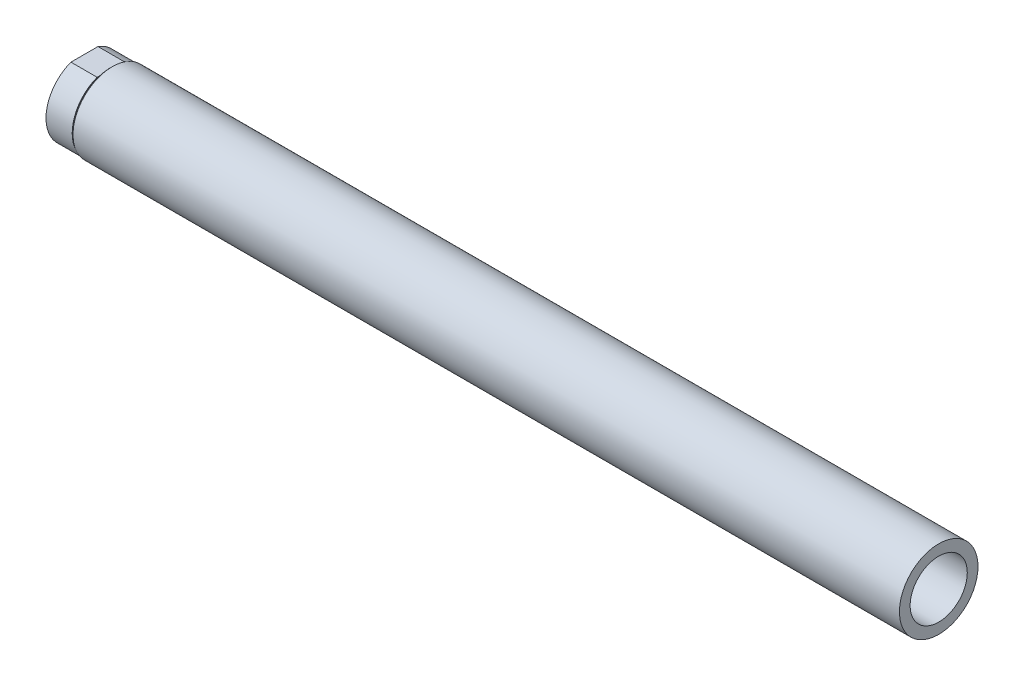
ISO-10303-21;
HEADER;
FILE_DESCRIPTION(('STEP AP214'),'2;1');
FILE_NAME('part.step','',(''),(''),'','','');
FILE_SCHEMA(('AUTOMOTIVE_DESIGN { 1 0 10303 214 1 1 1 1 }'));
ENDSEC;
DATA;
#1=APPLICATION_CONTEXT('core data for automotive mechanical design processes');
#2=APPLICATION_PROTOCOL_DEFINITION('international standard','automotive_design',2000,#1);
#3=PRODUCT_CONTEXT('',#1,'mechanical');
#4=PRODUCT('Part','Part','',(#3));
#5=PRODUCT_RELATED_PRODUCT_CATEGORY('part','',(#4));
#6=PRODUCT_DEFINITION_FORMATION('','',#4);
#7=PRODUCT_DEFINITION_CONTEXT('part definition',#1,'design');
#8=PRODUCT_DEFINITION('design','',#6,#7);
#9=PRODUCT_DEFINITION_SHAPE('','',#8);
#10=(LENGTH_UNIT() NAMED_UNIT(*) SI_UNIT(.MILLI.,.METRE.));
#11=(NAMED_UNIT(*) PLANE_ANGLE_UNIT() SI_UNIT($,.RADIAN.));
#12=(NAMED_UNIT(*) SI_UNIT($,.STERADIAN.) SOLID_ANGLE_UNIT());
#13=UNCERTAINTY_MEASURE_WITH_UNIT(LENGTH_MEASURE(1.E-05),#10,'distance_accuracy_value','');
#14=(GEOMETRIC_REPRESENTATION_CONTEXT(3) GLOBAL_UNCERTAINTY_ASSIGNED_CONTEXT((#13)) GLOBAL_UNIT_ASSIGNED_CONTEXT((#10,
#11,#12)) REPRESENTATION_CONTEXT('',''));
#15=CARTESIAN_POINT('',(0.,0.,0.));
#16=DIRECTION('',(0.,0.,1.));
#17=DIRECTION('',(1.,0.,0.));
#18=AXIS2_PLACEMENT_3D('',#15,#16,#17);
#19=CARTESIAN_POINT('',(-23.6261718694748,0.,0.));
#20=DIRECTION('',(1.,0.,0.));
#21=DIRECTION('',(0.,0.,-1.));
#22=AXIS2_PLACEMENT_3D('',#19,#20,#21);
#23=CYLINDRICAL_SURFACE('',#22,5.87499999999999);
#24=DIRECTION('',(1.,0.,0.));
#25=VECTOR('',#24,1.);
#26=CARTESIAN_POINT('',(-23.6261718694748,-5.50000000000002,2.06533895523223));
#27=LINE('',#26,#25);
#28=CARTESIAN_POINT('',(-63.25,-5.50000000000001,2.06533895523225));
#29=VERTEX_POINT('',#28);
#30=CARTESIAN_POINT('',(-67.25,-5.50000000000001,2.06533895523223));
#31=VERTEX_POINT('',#30);
#32=EDGE_CURVE('E97',#29,#31,#27,.F.);
#33=ORIENTED_EDGE('',*,*,#32,.F.);
#34=CARTESIAN_POINT('',(-63.25,0.,0.));
#35=DIRECTION('',(1.,0.,0.));
#36=DIRECTION('',(0.,0.,-1.));
#37=AXIS2_PLACEMENT_3D('',#34,#35,#36);
#38=CIRCLE('',#37,5.87499999999999);
#39=CARTESIAN_POINT('',(-63.25,5.5,2.06533895523228));
#40=VERTEX_POINT('',#39);
#41=EDGE_CURVE('E112',#40,#29,#38,.T.);
#42=ORIENTED_EDGE('',*,*,#41,.F.);
#43=DIRECTION('',(1.,0.,0.));
#44=VECTOR('',#43,1.);
#45=CARTESIAN_POINT('',(-23.6261718694748,5.50000000000001,2.06533895523226));
#46=LINE('',#45,#44);
#47=CARTESIAN_POINT('',(-67.25,5.5,2.06533895523226));
#48=VERTEX_POINT('',#47);
#49=EDGE_CURVE('E101',#48,#40,#46,.T.);
#50=ORIENTED_EDGE('',*,*,#49,.F.);
#51=CARTESIAN_POINT('',(-67.25,0.,0.));
#52=DIRECTION('',(1.,0.,0.));
#53=DIRECTION('',(0.,0.,-1.));
#54=AXIS2_PLACEMENT_3D('',#51,#52,#53);
#55=CIRCLE('',#54,5.87499999999999);
#56=EDGE_CURVE('E108',#48,#31,#55,.T.);
#57=ORIENTED_EDGE('',*,*,#56,.T.);
#58=EDGE_LOOP('',(#33,#42,#50,#57));
#59=FACE_BOUND('',#58,.T.);
#60=ADVANCED_FACE('F16',(#59),#23,.T.);
#61=CARTESIAN_POINT('',(-63.25,5.87499999999999,0.));
#62=DIRECTION('',(1.,0.,0.));
#63=DIRECTION('',(0.,0.,-1.));
#64=AXIS2_PLACEMENT_3D('',#61,#62,#63);
#65=PLANE('',#64);
#66=DIRECTION('',(0.,0.,1.));
#67=VECTOR('',#66,1.);
#68=CARTESIAN_POINT('',(-63.25,-5.50000000000001,0.));
#69=LINE('',#68,#67);
#70=CARTESIAN_POINT('',(-63.25,-5.50000000000001,-2.06533895523225));
#71=VERTEX_POINT('',#70);
#72=CARTESIAN_POINT('',(-63.25,-5.50000000000001,-1.66587381349844));
#73=VERTEX_POINT('',#72);
#74=EDGE_CURVE('E11',#71,#73,#69,.T.);
#75=ORIENTED_EDGE('',*,*,#74,.F.);
#76=CARTESIAN_POINT('',(-63.25,5.5,-2.06533895523228));
#77=VERTEX_POINT('',#76);
#78=EDGE_CURVE('E111',#71,#77,#38,.T.);
#79=ORIENTED_EDGE('',*,*,#78,.T.);
#80=DIRECTION('',(0.,0.,-1.));
#81=VECTOR('',#80,1.);
#82=CARTESIAN_POINT('',(-63.25,5.5,0.));
#83=LINE('',#82,#81);
#84=CARTESIAN_POINT('',(-63.25,5.5,-1.66587381349847));
#85=VERTEX_POINT('',#84);
#86=EDGE_CURVE('E130',#85,#77,#83,.T.);
#87=ORIENTED_EDGE('',*,*,#86,.F.);
#88=CARTESIAN_POINT('',(-63.25,0.,0.));
#89=DIRECTION('',(1.,0.,0.));
#90=DIRECTION('',(0.,0.,-1.));
#91=AXIS2_PLACEMENT_3D('',#88,#89,#90);
#92=CIRCLE('',#91,5.74674999999999);
#93=EDGE_CURVE('E128',#85,#73,#92,.F.);
#94=ORIENTED_EDGE('',*,*,#93,.T.);
#95=EDGE_LOOP('',(#75,#79,#87,#94));
#96=FACE_BOUND('',#95,.T.);
#97=ADVANCED_FACE('F154',(#96),#65,.T.);
#98=CARTESIAN_POINT('',(63.25,0.,0.));
#99=DIRECTION('',(1.,0.,0.));
#100=DIRECTION('',(0.,0.,-1.));
#101=AXIS2_PLACEMENT_3D('',#98,#99,#100);
#102=PLANE('',#101);
#103=CARTESIAN_POINT('',(63.25,0.,0.));
#104=DIRECTION('',(1.,0.,0.));
#105=DIRECTION('',(0.,0.,-1.));
#106=AXIS2_PLACEMENT_3D('',#103,#104,#105);
#107=CIRCLE('',#106,6.00075);
#108=CARTESIAN_POINT('',(63.25,0.,-6.00075));
#109=VERTEX_POINT('',#108);
#110=EDGE_CURVE('E118',#109,#109,#107,.T.);
#111=ORIENTED_EDGE('',*,*,#110,.T.);
#112=EDGE_LOOP('',(#111));
#113=FACE_BOUND('',#112,.T.);
#114=CARTESIAN_POINT('',(63.25,0.,0.));
#115=DIRECTION('',(1.,0.,0.));
#116=DIRECTION('',(0.,0.,-1.));
#117=AXIS2_PLACEMENT_3D('',#114,#115,#116);
#118=CIRCLE('',#117,4.365);
#119=CARTESIAN_POINT('',(63.25,0.,-4.365));
#120=VERTEX_POINT('',#119);
#121=EDGE_CURVE('E115',#120,#120,#118,.T.);
#122=ORIENTED_EDGE('',*,*,#121,.F.);
#123=EDGE_LOOP('',(#122));
#124=FACE_BOUND('',#123,.T.);
#125=ADVANCED_FACE('F178',(#113,#124),#102,.T.);
#126=CARTESIAN_POINT('',(63.25,0.,0.));
#127=DIRECTION('',(-1.,0.,0.));
#128=DIRECTION('',(0.,0.,1.));
#129=AXIS2_PLACEMENT_3D('',#126,#127,#128);
#130=CYLINDRICAL_SURFACE('',#129,6.00075);
#131=CARTESIAN_POINT('',(-62.996,0.,0.));
#132=DIRECTION('',(1.,0.,0.));
#133=DIRECTION('',(0.,0.,-1.));
#134=AXIS2_PLACEMENT_3D('',#131,#132,#133);
#135=CIRCLE('',#134,6.00075);
#136=CARTESIAN_POINT('',(-62.996,0.,-6.00075));
#137=VERTEX_POINT('',#136);
#138=EDGE_CURVE('E121',#137,#137,#135,.T.);
#139=ORIENTED_EDGE('',*,*,#138,.T.);
#140=EDGE_LOOP('',(#139));
#141=FACE_BOUND('',#140,.T.);
#142=ORIENTED_EDGE('',*,*,#110,.F.);
#143=EDGE_LOOP('',(#142));
#144=FACE_BOUND('',#143,.T.);
#145=ADVANCED_FACE('F252',(#141,#144),#130,.T.);
#146=CARTESIAN_POINT('',(63.25,0.,0.));
#147=DIRECTION('',(-1.,0.,0.));
#148=DIRECTION('',(0.,0.,1.));
#149=AXIS2_PLACEMENT_3D('',#146,#147,#148);
#150=CYLINDRICAL_SURFACE('',#149,4.365);
#151=CARTESIAN_POINT('',(-56.455,0.,0.));
#152=DIRECTION('',(1.,0.,0.));
#153=DIRECTION('',(0.,0.,-1.));
#154=AXIS2_PLACEMENT_3D('',#151,#152,#153);
#155=CIRCLE('',#154,4.365);
#156=CARTESIAN_POINT('',(-56.455,0.,-4.365));
#157=VERTEX_POINT('',#156);
#158=EDGE_CURVE('E127',#157,#157,#155,.T.);
#159=ORIENTED_EDGE('',*,*,#158,.F.);
#160=EDGE_LOOP('',(#159));
#161=FACE_BOUND('',#160,.T.);
#162=ORIENTED_EDGE('',*,*,#121,.T.);
#163=EDGE_LOOP('',(#162));
#164=FACE_BOUND('',#163,.T.);
#165=ADVANCED_FACE('F196',(#161,#164),#150,.F.);
#166=CARTESIAN_POINT('',(-62.996,0.,0.));
#167=DIRECTION('',(1.,0.,0.));
#168=DIRECTION('',(0.,0.,-1.));
#169=AXIS2_PLACEMENT_3D('',#166,#167,#168);
#170=CONICAL_SURFACE('',#169,6.00075,0.785398163397399);
#171=CARTESIAN_POINT('',(-63.25,5.5,1.66587381349847));
#172=VERTEX_POINT('',#171);
#173=EDGE_CURVE('E125',#172,#85,#92,.F.);
#174=ORIENTED_EDGE('',*,*,#173,.F.);
#175=CARTESIAN_POINT('',(-63.25,-5.50000000000001,1.66587381349844));
#176=VERTEX_POINT('',#175);
#177=EDGE_CURVE('E124',#176,#172,#92,.F.);
#178=ORIENTED_EDGE('',*,*,#177,.F.);
#179=EDGE_CURVE('E148',#73,#176,#92,.F.);
#180=ORIENTED_EDGE('',*,*,#179,.F.);
#181=ORIENTED_EDGE('',*,*,#93,.F.);
#182=EDGE_LOOP('',(#174,#178,#180,#181));
#183=FACE_BOUND('',#182,.T.);
#184=ORIENTED_EDGE('',*,*,#138,.F.);
#185=EDGE_LOOP('',(#184));
#186=FACE_BOUND('',#185,.T.);
#187=ADVANCED_FACE('F18',(#183,#186),#170,.T.);
#188=CARTESIAN_POINT('',(-67.25,5.87499999999999,0.));
#189=DIRECTION('',(-1.,0.,0.));
#190=DIRECTION('',(0.,0.,1.));
#191=AXIS2_PLACEMENT_3D('',#188,#189,#190);
#192=PLANE('',#191);
#193=CARTESIAN_POINT('',(-67.25,0.,0.));
#194=DIRECTION('',(-1.,0.,0.));
#195=DIRECTION('',(0.,0.,1.));
#196=AXIS2_PLACEMENT_3D('',#193,#194,#195);
#197=CIRCLE('',#196,2.5);
#198=CARTESIAN_POINT('',(-67.25,0.,2.5));
#199=VERTEX_POINT('',#198);
#200=EDGE_CURVE('E88',#199,#199,#197,.T.);
#201=ORIENTED_EDGE('',*,*,#200,.F.);
#202=EDGE_LOOP('',(#201));
#203=FACE_BOUND('',#202,.T.);
#204=DIRECTION('',(0.,0.,1.));
#205=VECTOR('',#204,1.);
#206=CARTESIAN_POINT('',(-67.25,-5.50000000000001,-6.00075));
#207=LINE('',#206,#205);
#208=CARTESIAN_POINT('',(-67.25,-5.50000000000001,-2.06533895523223));
#209=VERTEX_POINT('',#208);
#210=EDGE_CURVE('E91',#209,#31,#207,.T.);
#211=ORIENTED_EDGE('',*,*,#210,.T.);
#212=ORIENTED_EDGE('',*,*,#56,.F.);
#213=DIRECTION('',(0.,0.,1.));
#214=VECTOR('',#213,1.);
#215=CARTESIAN_POINT('',(-67.25,5.5,-6.00075));
#216=LINE('',#215,#214);
#217=CARTESIAN_POINT('',(-67.25,5.5,-2.06533895523226));
#218=VERTEX_POINT('',#217);
#219=EDGE_CURVE('E99',#218,#48,#216,.T.);
#220=ORIENTED_EDGE('',*,*,#219,.F.);
#221=EDGE_CURVE('E107',#209,#218,#55,.T.);
#222=ORIENTED_EDGE('',*,*,#221,.F.);
#223=EDGE_LOOP('',(#211,#212,#220,#222));
#224=FACE_BOUND('',#223,.T.);
#225=ADVANCED_FACE('F182',(#203,#224),#192,.T.);
#226=DIRECTION('',(1.,0.,0.));
#227=VECTOR('',#226,1.);
#228=CARTESIAN_POINT('',(-23.6261718694748,-5.50000000000002,-2.06533895523223));
#229=LINE('',#228,#227);
#230=EDGE_CURVE('E94',#209,#71,#229,.T.);
#231=ORIENTED_EDGE('',*,*,#230,.F.);
#232=ORIENTED_EDGE('',*,*,#221,.T.);
#233=DIRECTION('',(1.,0.,0.));
#234=VECTOR('',#233,1.);
#235=CARTESIAN_POINT('',(-23.6261718694748,5.50000000000001,-2.06533895523226));
#236=LINE('',#235,#234);
#237=EDGE_CURVE('E104',#77,#218,#236,.F.);
#238=ORIENTED_EDGE('',*,*,#237,.F.);
#239=ORIENTED_EDGE('',*,*,#78,.F.);
#240=EDGE_LOOP('',(#231,#232,#238,#239));
#241=FACE_BOUND('',#240,.T.);
#242=ADVANCED_FACE('F174',(#241),#23,.T.);
#243=EDGE_CURVE('E20',#176,#29,#69,.T.);
#244=ORIENTED_EDGE('',*,*,#243,.F.);
#245=ORIENTED_EDGE('',*,*,#177,.T.);
#246=EDGE_CURVE('E131',#40,#172,#83,.T.);
#247=ORIENTED_EDGE('',*,*,#246,.F.);
#248=ORIENTED_EDGE('',*,*,#41,.T.);
#249=EDGE_LOOP('',(#244,#245,#247,#248));
#250=FACE_BOUND('',#249,.T.);
#251=ADVANCED_FACE('F144',(#250),#65,.T.);
#252=CARTESIAN_POINT('',(-56.455,4.365,0.));
#253=DIRECTION('',(1.,0.,0.));
#254=DIRECTION('',(0.,0.,-1.));
#255=AXIS2_PLACEMENT_3D('',#252,#253,#254);
#256=PLANE('',#255);
#257=ORIENTED_EDGE('',*,*,#158,.T.);
#258=EDGE_LOOP('',(#257));
#259=FACE_BOUND('',#258,.T.);
#260=ADVANCED_FACE('F161',(#259),#256,.T.);
#261=CARTESIAN_POINT('',(-63.25,5.87499999999999,-6.00075));
#262=DIRECTION('',(1.,0.,0.));
#263=DIRECTION('',(0.,0.,-1.));
#264=AXIS2_PLACEMENT_3D('',#261,#262,#263);
#265=PLANE('',#264);
#266=ORIENTED_EDGE('',*,*,#173,.T.);
#267=DIRECTION('',(0.,0.,1.));
#268=VECTOR('',#267,1.);
#269=CARTESIAN_POINT('',(-63.25,5.5,-6.00075));
#270=LINE('',#269,#268);
#271=EDGE_CURVE('E38',#85,#172,#270,.T.);
#272=ORIENTED_EDGE('',*,*,#271,.T.);
#273=EDGE_LOOP('',(#266,#272));
#274=FACE_BOUND('',#273,.T.);
#275=ADVANCED_FACE('F158',(#274),#265,.F.);
#276=CARTESIAN_POINT('',(-67.25,5.5,-6.00075));
#277=DIRECTION('',(0.,-1.,0.));
#278=DIRECTION('',(1.,0.,0.));
#279=AXIS2_PLACEMENT_3D('',#276,#277,#278);
#280=PLANE('',#279);
#281=ORIENTED_EDGE('',*,*,#237,.T.);
#282=ORIENTED_EDGE('',*,*,#219,.T.);
#283=ORIENTED_EDGE('',*,*,#49,.T.);
#284=ORIENTED_EDGE('',*,*,#246,.T.);
#285=ORIENTED_EDGE('',*,*,#271,.F.);
#286=ORIENTED_EDGE('',*,*,#86,.T.);
#287=EDGE_LOOP('',(#281,#282,#283,#284,#285,#286));
#288=FACE_BOUND('',#287,.T.);
#289=ADVANCED_FACE('F160',(#288),#280,.F.);
#290=CARTESIAN_POINT('',(-67.25,-5.50000000000001,-6.00075));
#291=DIRECTION('',(0.,1.,0.));
#292=DIRECTION('',(-1.,0.,0.));
#293=AXIS2_PLACEMENT_3D('',#290,#291,#292);
#294=PLANE('',#293);
#295=ORIENTED_EDGE('',*,*,#32,.T.);
#296=ORIENTED_EDGE('',*,*,#210,.F.);
#297=ORIENTED_EDGE('',*,*,#230,.T.);
#298=ORIENTED_EDGE('',*,*,#74,.T.);
#299=DIRECTION('',(0.,0.,1.));
#300=VECTOR('',#299,1.);
#301=CARTESIAN_POINT('',(-63.25,-5.50000000000001,-6.00075));
#302=LINE('',#301,#300);
#303=EDGE_CURVE('E30',#73,#176,#302,.T.);
#304=ORIENTED_EDGE('',*,*,#303,.T.);
#305=ORIENTED_EDGE('',*,*,#243,.T.);
#306=EDGE_LOOP('',(#295,#296,#297,#298,#304,#305));
#307=FACE_BOUND('',#306,.T.);
#308=ADVANCED_FACE('F137',(#307),#294,.F.);
#309=CARTESIAN_POINT('',(-63.25,-5.875,-6.00075));
#310=DIRECTION('',(1.,0.,0.));
#311=DIRECTION('',(0.,0.,-1.));
#312=AXIS2_PLACEMENT_3D('',#309,#310,#311);
#313=PLANE('',#312);
#314=ORIENTED_EDGE('',*,*,#179,.T.);
#315=ORIENTED_EDGE('',*,*,#303,.F.);
#316=EDGE_LOOP('',(#314,#315));
#317=FACE_BOUND('',#316,.T.);
#318=ADVANCED_FACE('F202',(#317),#313,.F.);
#319=CARTESIAN_POINT('',(-67.25,0.,0.));
#320=DIRECTION('',(-1.,0.,0.));
#321=DIRECTION('',(0.,0.,1.));
#322=AXIS2_PLACEMENT_3D('',#319,#320,#321);
#323=CYLINDRICAL_SURFACE('',#322,2.5);
#324=CARTESIAN_POINT('',(-60.2396,0.,0.));
#325=DIRECTION('',(-1.,0.,0.));
#326=DIRECTION('',(0.,0.,1.));
#327=AXIS2_PLACEMENT_3D('',#324,#325,#326);
#328=CIRCLE('',#327,2.5);
#329=CARTESIAN_POINT('',(-60.2396,0.,2.5));
#330=VERTEX_POINT('',#329);
#331=EDGE_CURVE('E83',#330,#330,#328,.T.);
#332=ORIENTED_EDGE('',*,*,#331,.F.);
#333=EDGE_LOOP('',(#332));
#334=FACE_BOUND('',#333,.T.);
#335=ORIENTED_EDGE('',*,*,#200,.T.);
#336=EDGE_LOOP('',(#335));
#337=FACE_BOUND('',#336,.T.);
#338=ADVANCED_FACE('F199',(#334,#337),#323,.F.);
#339=CARTESIAN_POINT('',(-60.2396,2.1,0.));
#340=DIRECTION('',(1.,0.,0.));
#341=DIRECTION('',(0.,0.,-1.));
#342=AXIS2_PLACEMENT_3D('',#339,#340,#341);
#343=PLANE('',#342);
#344=CARTESIAN_POINT('',(-60.2396,0.,0.));
#345=DIRECTION('',(-1.,0.,0.));
#346=DIRECTION('',(0.,0.,1.));
#347=AXIS2_PLACEMENT_3D('',#344,#345,#346);
#348=CIRCLE('',#347,2.1);
#349=CARTESIAN_POINT('',(-60.2396,0.,2.1));
#350=VERTEX_POINT('',#349);
#351=EDGE_CURVE('E80',#350,#350,#348,.T.);
#352=ORIENTED_EDGE('',*,*,#351,.F.);
#353=EDGE_LOOP('',(#352));
#354=FACE_BOUND('',#353,.T.);
#355=ORIENTED_EDGE('',*,*,#331,.T.);
#356=EDGE_LOOP('',(#355));
#357=FACE_BOUND('',#356,.T.);
#358=ADVANCED_FACE('F201',(#354,#357),#343,.F.);
#359=CARTESIAN_POINT('',(-67.25,0.,0.));
#360=DIRECTION('',(-1.,0.,0.));
#361=DIRECTION('',(0.,0.,1.));
#362=AXIS2_PLACEMENT_3D('',#359,#360,#361);
#363=CYLINDRICAL_SURFACE('',#362,2.1);
#364=CARTESIAN_POINT('',(-57.8396048,0.,0.));
#365=DIRECTION('',(-1.,0.,0.));
#366=DIRECTION('',(0.,0.,1.));
#367=AXIS2_PLACEMENT_3D('',#364,#365,#366);
#368=CIRCLE('',#367,2.1);
#369=CARTESIAN_POINT('',(-57.8396048,0.,2.1));
#370=VERTEX_POINT('',#369);
#371=EDGE_CURVE('E78',#370,#370,#368,.T.);
#372=ORIENTED_EDGE('',*,*,#371,.F.);
#373=EDGE_LOOP('',(#372));
#374=FACE_BOUND('',#373,.T.);
#375=ORIENTED_EDGE('',*,*,#351,.T.);
#376=EDGE_LOOP('',(#375));
#377=FACE_BOUND('',#376,.T.);
#378=ADVANCED_FACE('F74',(#374,#377),#363,.F.);
#379=CARTESIAN_POINT('',(-57.8396048,0.,0.));
#380=DIRECTION('',(-1.,0.,0.));
#381=DIRECTION('',(0.,0.,1.));
#382=AXIS2_PLACEMENT_3D('',#379,#380,#381);
#383=CONICAL_SURFACE('',#382,2.1,1.02974425867665);
#384=CARTESIAN_POINT('',(-56.5777975000421,0.,0.));
#385=VERTEX_POINT('',#384);
#386=VERTEX_LOOP('',#385);
#387=FACE_BOUND('',#386,.T.);
#388=ORIENTED_EDGE('',*,*,#371,.T.);
#389=EDGE_LOOP('',(#388));
#390=FACE_BOUND('',#389,.T.);
#391=ADVANCED_FACE('F71',(#387,#390),#383,.F.);
#392=CLOSED_SHELL('',(#60,#97,#125,#145,#165,#187,#225,#242,#251,#260,#275,#289,#308,#318,#338,
#358,#378,#391));
#393=MANIFOLD_SOLID_BREP('B1',#392);
#394=ADVANCED_BREP_SHAPE_REPRESENTATION('',(#18,#393),#14);
#395=SHAPE_DEFINITION_REPRESENTATION(#9,#394);
ENDSEC;
END-ISO-10303-21;
